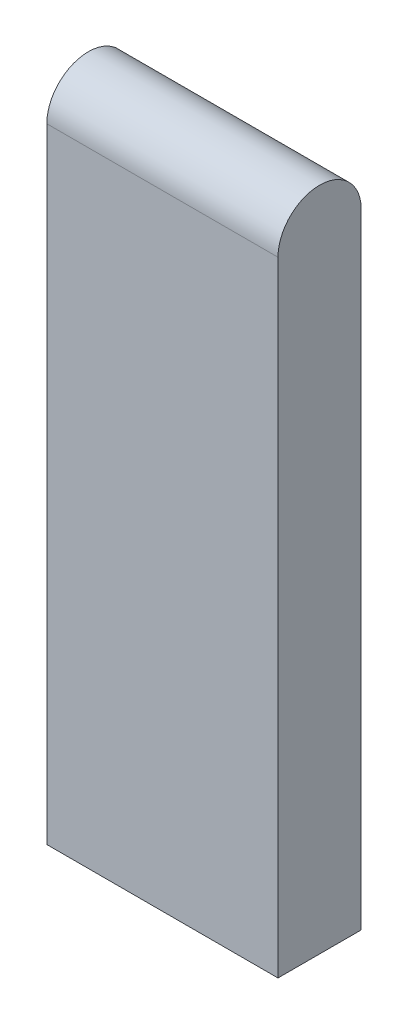
ISO-10303-21;
HEADER;
FILE_DESCRIPTION(('STEP AP214'),'2;1');
FILE_NAME('part.step','',(''),(''),'','','');
FILE_SCHEMA(('AUTOMOTIVE_DESIGN { 1 0 10303 214 1 1 1 1 }'));
ENDSEC;
DATA;
#1=APPLICATION_CONTEXT('core data for automotive mechanical design processes');
#2=APPLICATION_PROTOCOL_DEFINITION('international standard','automotive_design',2000,#1);
#3=PRODUCT_CONTEXT('',#1,'mechanical');
#4=PRODUCT('Part','Part','',(#3));
#5=PRODUCT_RELATED_PRODUCT_CATEGORY('part','',(#4));
#6=PRODUCT_DEFINITION_FORMATION('','',#4);
#7=PRODUCT_DEFINITION_CONTEXT('part definition',#1,'design');
#8=PRODUCT_DEFINITION('design','',#6,#7);
#9=PRODUCT_DEFINITION_SHAPE('','',#8);
#10=(LENGTH_UNIT() NAMED_UNIT(*) SI_UNIT(.MILLI.,.METRE.));
#11=(NAMED_UNIT(*) PLANE_ANGLE_UNIT() SI_UNIT($,.RADIAN.));
#12=(NAMED_UNIT(*) SI_UNIT($,.STERADIAN.) SOLID_ANGLE_UNIT());
#13=UNCERTAINTY_MEASURE_WITH_UNIT(LENGTH_MEASURE(1.E-05),#10,'distance_accuracy_value','');
#14=(GEOMETRIC_REPRESENTATION_CONTEXT(3) GLOBAL_UNCERTAINTY_ASSIGNED_CONTEXT((#13)) GLOBAL_UNIT_ASSIGNED_CONTEXT((#10,
#11,#12)) REPRESENTATION_CONTEXT('',''));
#15=CARTESIAN_POINT('',(0.,0.,0.));
#16=DIRECTION('',(0.,0.,1.));
#17=DIRECTION('',(1.,0.,0.));
#18=AXIS2_PLACEMENT_3D('',#15,#16,#17);
#19=CARTESIAN_POINT('',(25.,67.5,-8.99999999999999));
#20=DIRECTION('',(0.,0.,1.));
#21=DIRECTION('',(0.,-1.,0.));
#22=AXIS2_PLACEMENT_3D('',#19,#20,#21);
#23=PLANE('',#22);
#24=DIRECTION('',(0.,1.,0.));
#25=VECTOR('',#24,1.);
#26=CARTESIAN_POINT('',(-25.,67.5,-8.99999999999999));
#27=LINE('',#26,#25);
#28=CARTESIAN_POINT('',(-25.,-67.5,-9.00000000000001));
#29=VERTEX_POINT('',#28);
#30=CARTESIAN_POINT('',(-25.,67.5,-8.99999999999999));
#31=VERTEX_POINT('',#30);
#32=EDGE_CURVE('E100',#29,#31,#27,.T.);
#33=ORIENTED_EDGE('',*,*,#32,.T.);
#34=DIRECTION('',(-1.,0.,0.));
#35=VECTOR('',#34,1.);
#36=CARTESIAN_POINT('',(25.,67.5,-8.99999999999999));
#37=LINE('',#36,#35);
#38=CARTESIAN_POINT('',(25.,67.5,-8.99999999999999));
#39=VERTEX_POINT('',#38);
#40=EDGE_CURVE('E11',#39,#31,#37,.T.);
#41=ORIENTED_EDGE('',*,*,#40,.F.);
#42=DIRECTION('',(0.,1.,0.));
#43=VECTOR('',#42,1.);
#44=CARTESIAN_POINT('',(25.,67.5,-8.99999999999999));
#45=LINE('',#44,#43);
#46=CARTESIAN_POINT('',(25.,-67.5,-9.00000000000001));
#47=VERTEX_POINT('',#46);
#48=EDGE_CURVE('E88',#47,#39,#45,.T.);
#49=ORIENTED_EDGE('',*,*,#48,.F.);
#50=DIRECTION('',(-1.,0.,0.));
#51=VECTOR('',#50,1.);
#52=CARTESIAN_POINT('',(25.,-67.5,-9.00000000000001));
#53=LINE('',#52,#51);
#54=EDGE_CURVE('E96',#47,#29,#53,.T.);
#55=ORIENTED_EDGE('',*,*,#54,.T.);
#56=EDGE_LOOP('',(#33,#41,#49,#55));
#57=FACE_BOUND('',#56,.T.);
#58=ADVANCED_FACE('F37',(#57),#23,.F.);
#59=CARTESIAN_POINT('',(25.,67.5,0.));
#60=DIRECTION('',(-1.,0.,0.));
#61=DIRECTION('',(0.,0.,1.));
#62=AXIS2_PLACEMENT_3D('',#59,#60,#61);
#63=CYLINDRICAL_SURFACE('',#62,9.);
#64=CARTESIAN_POINT('',(-25.,67.5,0.));
#65=DIRECTION('',(1.,0.,0.));
#66=DIRECTION('',(0.,0.,1.));
#67=AXIS2_PLACEMENT_3D('',#64,#65,#66);
#68=CIRCLE('',#67,9.);
#69=CARTESIAN_POINT('',(-25.,67.5,9.00000000000001));
#70=VERTEX_POINT('',#69);
#71=EDGE_CURVE('E92',#31,#70,#68,.T.);
#72=ORIENTED_EDGE('',*,*,#71,.T.);
#73=DIRECTION('',(-1.,0.,0.));
#74=VECTOR('',#73,1.);
#75=CARTESIAN_POINT('',(25.,67.5,9.00000000000001));
#76=LINE('',#75,#74);
#77=CARTESIAN_POINT('',(25.,67.5,9.00000000000001));
#78=VERTEX_POINT('',#77);
#79=EDGE_CURVE('E45',#78,#70,#76,.T.);
#80=ORIENTED_EDGE('',*,*,#79,.F.);
#81=CARTESIAN_POINT('',(25.,67.5,0.));
#82=DIRECTION('',(1.,0.,0.));
#83=DIRECTION('',(0.,0.,1.));
#84=AXIS2_PLACEMENT_3D('',#81,#82,#83);
#85=CIRCLE('',#84,9.);
#86=EDGE_CURVE('E83',#39,#78,#85,.T.);
#87=ORIENTED_EDGE('',*,*,#86,.F.);
#88=ORIENTED_EDGE('',*,*,#40,.T.);
#89=EDGE_LOOP('',(#72,#80,#87,#88));
#90=FACE_BOUND('',#89,.T.);
#91=ADVANCED_FACE('F91',(#90),#63,.T.);
#92=CARTESIAN_POINT('',(25.,67.5,9.00000000000001));
#93=DIRECTION('',(0.,0.,-1.));
#94=DIRECTION('',(0.,1.,0.));
#95=AXIS2_PLACEMENT_3D('',#92,#93,#94);
#96=PLANE('',#95);
#97=DIRECTION('',(0.,-1.,0.));
#98=VECTOR('',#97,1.);
#99=CARTESIAN_POINT('',(-25.,67.5,9.00000000000001));
#100=LINE('',#99,#98);
#101=CARTESIAN_POINT('',(-25.,-67.5,8.99999999999999));
#102=VERTEX_POINT('',#101);
#103=EDGE_CURVE('E70',#70,#102,#100,.T.);
#104=ORIENTED_EDGE('',*,*,#103,.T.);
#105=DIRECTION('',(-1.,0.,0.));
#106=VECTOR('',#105,1.);
#107=CARTESIAN_POINT('',(25.,-67.5,8.99999999999999));
#108=LINE('',#107,#106);
#109=CARTESIAN_POINT('',(25.,-67.5,8.99999999999999));
#110=VERTEX_POINT('',#109);
#111=EDGE_CURVE('E93',#110,#102,#108,.T.);
#112=ORIENTED_EDGE('',*,*,#111,.F.);
#113=DIRECTION('',(0.,-1.,0.));
#114=VECTOR('',#113,1.);
#115=CARTESIAN_POINT('',(25.,67.5,9.00000000000001));
#116=LINE('',#115,#114);
#117=EDGE_CURVE('E86',#78,#110,#116,.T.);
#118=ORIENTED_EDGE('',*,*,#117,.F.);
#119=ORIENTED_EDGE('',*,*,#79,.T.);
#120=EDGE_LOOP('',(#104,#112,#118,#119));
#121=FACE_BOUND('',#120,.T.);
#122=ADVANCED_FACE('F94',(#121),#96,.F.);
#123=CARTESIAN_POINT('',(25.,-67.5,8.99999999999999));
#124=DIRECTION('',(0.,1.,0.));
#125=DIRECTION('',(0.,0.,1.));
#126=AXIS2_PLACEMENT_3D('',#123,#124,#125);
#127=PLANE('',#126);
#128=DIRECTION('',(0.,0.,-1.));
#129=VECTOR('',#128,1.);
#130=CARTESIAN_POINT('',(-25.,-67.5,8.99999999999999));
#131=LINE('',#130,#129);
#132=EDGE_CURVE('E76',#102,#29,#131,.T.);
#133=ORIENTED_EDGE('',*,*,#132,.T.);
#134=ORIENTED_EDGE('',*,*,#54,.F.);
#135=DIRECTION('',(0.,0.,-1.));
#136=VECTOR('',#135,1.);
#137=CARTESIAN_POINT('',(25.,-67.5,8.99999999999999));
#138=LINE('',#137,#136);
#139=EDGE_CURVE('E53',#110,#47,#138,.T.);
#140=ORIENTED_EDGE('',*,*,#139,.F.);
#141=ORIENTED_EDGE('',*,*,#111,.T.);
#142=EDGE_LOOP('',(#133,#134,#140,#141));
#143=FACE_BOUND('',#142,.T.);
#144=ADVANCED_FACE('F107',(#143),#127,.F.);
#145=CARTESIAN_POINT('',(25.,67.5,0.));
#146=DIRECTION('',(-1.,0.,0.));
#147=DIRECTION('',(0.,0.,1.));
#148=AXIS2_PLACEMENT_3D('',#145,#146,#147);
#149=PLANE('',#148);
#150=ORIENTED_EDGE('',*,*,#48,.T.);
#151=ORIENTED_EDGE('',*,*,#86,.T.);
#152=ORIENTED_EDGE('',*,*,#117,.T.);
#153=ORIENTED_EDGE('',*,*,#139,.T.);
#154=EDGE_LOOP('',(#150,#151,#152,#153));
#155=FACE_BOUND('',#154,.T.);
#156=ADVANCED_FACE('F84',(#155),#149,.F.);
#157=CARTESIAN_POINT('',(-25.,67.5,0.));
#158=DIRECTION('',(-1.,0.,0.));
#159=DIRECTION('',(0.,0.,1.));
#160=AXIS2_PLACEMENT_3D('',#157,#158,#159);
#161=PLANE('',#160);
#162=ORIENTED_EDGE('',*,*,#32,.F.);
#163=ORIENTED_EDGE('',*,*,#132,.F.);
#164=ORIENTED_EDGE('',*,*,#103,.F.);
#165=ORIENTED_EDGE('',*,*,#71,.F.);
#166=EDGE_LOOP('',(#162,#163,#164,#165));
#167=FACE_BOUND('',#166,.T.);
#168=ADVANCED_FACE('F110',(#167),#161,.T.);
#169=CLOSED_SHELL('',(#58,#91,#122,#144,#156,#168));
#170=MANIFOLD_SOLID_BREP('B2',#169);
#171=ADVANCED_BREP_SHAPE_REPRESENTATION('',(#18,#170),#14);
#172=SHAPE_DEFINITION_REPRESENTATION(#9,#171);
ENDSEC;
END-ISO-10303-21;
